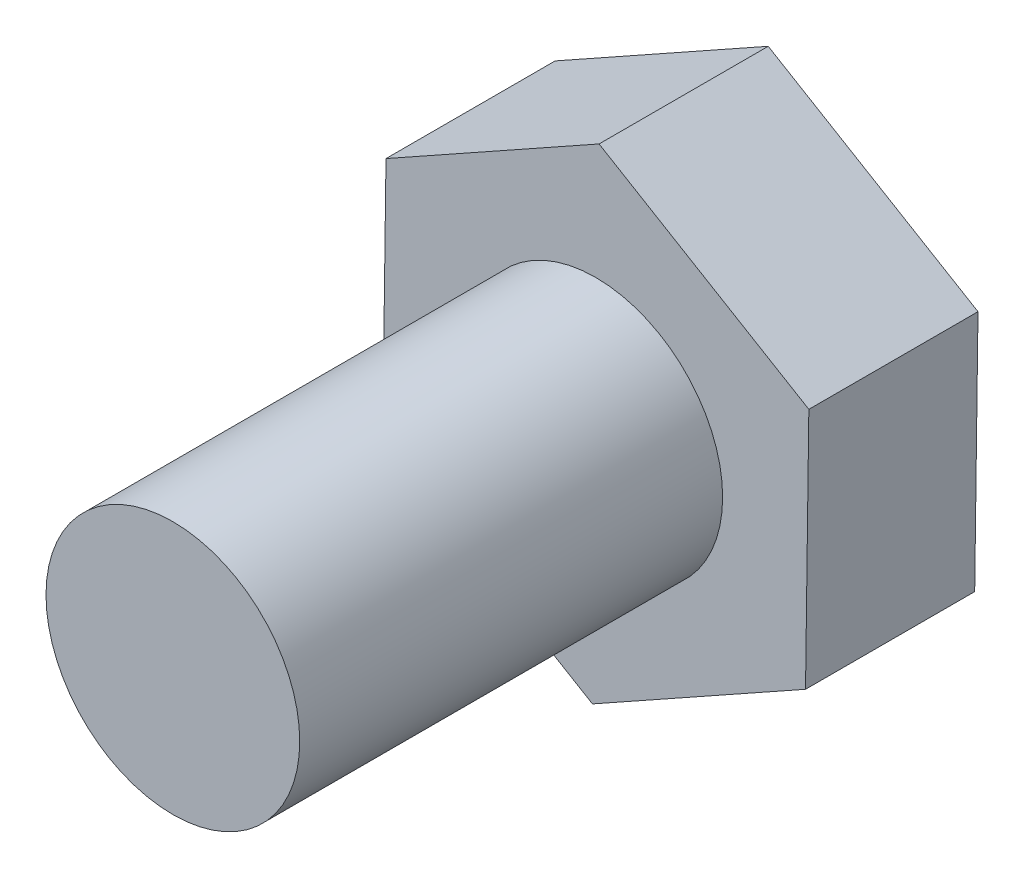
ISO-10303-21;
HEADER;
FILE_DESCRIPTION(('STEP AP214'),'2;1');
FILE_NAME('part.step','',(''),(''),'','','');
FILE_SCHEMA(('AUTOMOTIVE_DESIGN { 1 0 10303 214 1 1 1 1 }'));
ENDSEC;
DATA;
#1=APPLICATION_CONTEXT('core data for automotive mechanical design processes');
#2=APPLICATION_PROTOCOL_DEFINITION('international standard','automotive_design',2000,#1);
#3=PRODUCT_CONTEXT('',#1,'mechanical');
#4=PRODUCT('Part','Part','',(#3));
#5=PRODUCT_RELATED_PRODUCT_CATEGORY('part','',(#4));
#6=PRODUCT_DEFINITION_FORMATION('','',#4);
#7=PRODUCT_DEFINITION_CONTEXT('part definition',#1,'design');
#8=PRODUCT_DEFINITION('design','',#6,#7);
#9=PRODUCT_DEFINITION_SHAPE('','',#8);
#10=(LENGTH_UNIT() NAMED_UNIT(*) SI_UNIT(.MILLI.,.METRE.));
#11=(NAMED_UNIT(*) PLANE_ANGLE_UNIT() SI_UNIT($,.RADIAN.));
#12=(NAMED_UNIT(*) SI_UNIT($,.STERADIAN.) SOLID_ANGLE_UNIT());
#13=UNCERTAINTY_MEASURE_WITH_UNIT(LENGTH_MEASURE(1.E-05),#10,'distance_accuracy_value','');
#14=(GEOMETRIC_REPRESENTATION_CONTEXT(3) GLOBAL_UNCERTAINTY_ASSIGNED_CONTEXT((#13)) GLOBAL_UNIT_ASSIGNED_CONTEXT((#10,
#11,#12)) REPRESENTATION_CONTEXT('',''));
#15=CARTESIAN_POINT('',(0.,0.,0.));
#16=DIRECTION('',(0.,0.,1.));
#17=DIRECTION('',(1.,0.,0.));
#18=AXIS2_PLACEMENT_3D('',#15,#16,#17);
#19=CARTESIAN_POINT('',(-0.0783467129785345,-5.77297108306449,4.));
#20=DIRECTION('',(-0.488201954377901,0.872730686833916,0.));
#21=DIRECTION('',(-0.872730686833916,-0.488201954377901,0.));
#22=AXIS2_PLACEMENT_3D('',#19,#20,#21);
#23=PLANE('',#22);
#24=DIRECTION('',(0.872730686833916,0.488201954377901,0.));
#25=VECTOR('',#24,1.);
#26=CARTESIAN_POINT('',(-0.0783467129785345,-5.77297108306449,0.));
#27=LINE('',#26,#25);
#28=CARTESIAN_POINT('',(-0.0783467129785345,-5.77297108306449,0.));
#29=VERTEX_POINT('',#28);
#30=CARTESIAN_POINT('',(4.96036625675755,-2.95433578527466,0.));
#31=VERTEX_POINT('',#30);
#32=EDGE_CURVE('E117',#29,#31,#27,.T.);
#33=ORIENTED_EDGE('',*,*,#32,.T.);
#34=DIRECTION('',(0.,0.,-1.));
#35=VECTOR('',#34,1.);
#36=CARTESIAN_POINT('',(4.96036625675755,-2.95433578527466,4.));
#37=LINE('',#36,#35);
#38=CARTESIAN_POINT('',(4.96036625675755,-2.95433578527466,4.));
#39=VERTEX_POINT('',#38);
#40=EDGE_CURVE('E11',#39,#31,#37,.T.);
#41=ORIENTED_EDGE('',*,*,#40,.F.);
#42=DIRECTION('',(0.872730686833916,0.488201954377901,0.));
#43=VECTOR('',#42,1.);
#44=CARTESIAN_POINT('',(-0.0783467129785345,-5.77297108306449,4.));
#45=LINE('',#44,#43);
#46=CARTESIAN_POINT('',(-0.0783467129785345,-5.77297108306449,4.));
#47=VERTEX_POINT('',#46);
#48=EDGE_CURVE('E128',#47,#39,#45,.T.);
#49=ORIENTED_EDGE('',*,*,#48,.F.);
#50=DIRECTION('',(0.,0.,-1.));
#51=VECTOR('',#50,1.);
#52=CARTESIAN_POINT('',(-0.0783467129785345,-5.77297108306449,4.));
#53=LINE('',#52,#51);
#54=EDGE_CURVE('E113',#47,#29,#53,.T.);
#55=ORIENTED_EDGE('',*,*,#54,.T.);
#56=EDGE_LOOP('',(#33,#41,#49,#55));
#57=FACE_BOUND('',#56,.T.);
#58=ADVANCED_FACE('F33',(#57),#23,.F.);
#59=CARTESIAN_POINT('',(4.96036625675755,-2.95433578527466,4.));
#60=DIRECTION('',(-0.999907922649363,0.0135700487484835,0.));
#61=DIRECTION('',(-0.0135700487484835,-0.999907922649363,0.));
#62=AXIS2_PLACEMENT_3D('',#59,#60,#61);
#63=PLANE('',#62);
#64=DIRECTION('',(0.0135700487484835,0.999907922649363,0.));
#65=VECTOR('',#64,1.);
#66=CARTESIAN_POINT('',(4.96036625675755,-2.95433578527466,0.));
#67=LINE('',#66,#65);
#68=CARTESIAN_POINT('',(5.03871296973608,2.81863529778983,0.));
#69=VERTEX_POINT('',#68);
#70=EDGE_CURVE('E120',#31,#69,#67,.T.);
#71=ORIENTED_EDGE('',*,*,#70,.T.);
#72=DIRECTION('',(0.,0.,-1.));
#73=VECTOR('',#72,1.);
#74=CARTESIAN_POINT('',(5.03871296973608,2.81863529778983,4.));
#75=LINE('',#74,#73);
#76=CARTESIAN_POINT('',(5.03871296973608,2.81863529778983,4.));
#77=VERTEX_POINT('',#76);
#78=EDGE_CURVE('E41',#77,#69,#75,.T.);
#79=ORIENTED_EDGE('',*,*,#78,.F.);
#80=DIRECTION('',(0.0135700487484835,0.999907922649363,0.));
#81=VECTOR('',#80,1.);
#82=CARTESIAN_POINT('',(4.96036625675755,-2.95433578527466,4.));
#83=LINE('',#82,#81);
#84=EDGE_CURVE('E86',#39,#77,#83,.T.);
#85=ORIENTED_EDGE('',*,*,#84,.F.);
#86=ORIENTED_EDGE('',*,*,#40,.T.);
#87=EDGE_LOOP('',(#71,#79,#85,#86));
#88=FACE_BOUND('',#87,.T.);
#89=ADVANCED_FACE('F153',(#88),#63,.F.);
#90=CARTESIAN_POINT('',(5.03871296973608,2.81863529778983,4.));
#91=DIRECTION('',(-0.511705968271462,-0.859160638085432,0.));
#92=DIRECTION('',(0.859160638085432,-0.511705968271462,0.));
#93=AXIS2_PLACEMENT_3D('',#90,#91,#92);
#94=PLANE('',#93);
#95=DIRECTION('',(-0.859160638085432,0.511705968271462,0.));
#96=VECTOR('',#95,1.);
#97=CARTESIAN_POINT('',(5.03871296973608,2.81863529778983,0.));
#98=LINE('',#97,#96);
#99=CARTESIAN_POINT('',(0.0783467129785357,5.77297108306449,0.));
#100=VERTEX_POINT('',#99);
#101=EDGE_CURVE('E123',#69,#100,#98,.T.);
#102=ORIENTED_EDGE('',*,*,#101,.T.);
#103=DIRECTION('',(0.,0.,-1.));
#104=VECTOR('',#103,1.);
#105=CARTESIAN_POINT('',(0.0783467129785357,5.77297108306449,4.));
#106=LINE('',#105,#104);
#107=CARTESIAN_POINT('',(0.0783467129785357,5.77297108306449,4.));
#108=VERTEX_POINT('',#107);
#109=EDGE_CURVE('E108',#108,#100,#106,.T.);
#110=ORIENTED_EDGE('',*,*,#109,.F.);
#111=DIRECTION('',(-0.859160638085432,0.511705968271462,0.));
#112=VECTOR('',#111,1.);
#113=CARTESIAN_POINT('',(5.03871296973608,2.81863529778983,4.));
#114=LINE('',#113,#112);
#115=EDGE_CURVE('E99',#77,#108,#114,.T.);
#116=ORIENTED_EDGE('',*,*,#115,.F.);
#117=ORIENTED_EDGE('',*,*,#78,.T.);
#118=EDGE_LOOP('',(#102,#110,#116,#117));
#119=FACE_BOUND('',#118,.T.);
#120=ADVANCED_FACE('F134',(#119),#94,.F.);
#121=CARTESIAN_POINT('',(0.0783467129785357,5.77297108306449,4.));
#122=DIRECTION('',(0.488201954377901,-0.872730686833916,0.));
#123=DIRECTION('',(0.872730686833916,0.488201954377901,0.));
#124=AXIS2_PLACEMENT_3D('',#121,#122,#123);
#125=PLANE('',#124);
#126=DIRECTION('',(-0.872730686833916,-0.488201954377901,0.));
#127=VECTOR('',#126,1.);
#128=CARTESIAN_POINT('',(0.0783467129785357,5.77297108306449,0.));
#129=LINE('',#128,#127);
#130=CARTESIAN_POINT('',(-4.96036625675755,2.95433578527466,0.));
#131=VERTEX_POINT('',#130);
#132=EDGE_CURVE('E107',#100,#131,#129,.T.);
#133=ORIENTED_EDGE('',*,*,#132,.T.);
#134=DIRECTION('',(0.,0.,-1.));
#135=VECTOR('',#134,1.);
#136=CARTESIAN_POINT('',(-4.96036625675755,2.95433578527466,4.));
#137=LINE('',#136,#135);
#138=CARTESIAN_POINT('',(-4.96036625675755,2.95433578527466,4.));
#139=VERTEX_POINT('',#138);
#140=EDGE_CURVE('E104',#139,#131,#137,.T.);
#141=ORIENTED_EDGE('',*,*,#140,.F.);
#142=DIRECTION('',(-0.872730686833916,-0.488201954377901,0.));
#143=VECTOR('',#142,1.);
#144=CARTESIAN_POINT('',(0.0783467129785357,5.77297108306449,4.));
#145=LINE('',#144,#143);
#146=EDGE_CURVE('E93',#108,#139,#145,.T.);
#147=ORIENTED_EDGE('',*,*,#146,.F.);
#148=ORIENTED_EDGE('',*,*,#109,.T.);
#149=EDGE_LOOP('',(#133,#141,#147,#148));
#150=FACE_BOUND('',#149,.T.);
#151=ADVANCED_FACE('F105',(#150),#125,.F.);
#152=CARTESIAN_POINT('',(-4.96036625675755,2.95433578527466,4.));
#153=DIRECTION('',(0.999907922649363,-0.0135700487484838,0.));
#154=DIRECTION('',(0.0135700487484838,0.999907922649363,0.));
#155=AXIS2_PLACEMENT_3D('',#152,#153,#154);
#156=PLANE('',#155);
#157=DIRECTION('',(-0.0135700487484838,-0.999907922649363,0.));
#158=VECTOR('',#157,1.);
#159=CARTESIAN_POINT('',(-4.96036625675755,2.95433578527466,0.));
#160=LINE('',#159,#158);
#161=CARTESIAN_POINT('',(-5.03871296973608,-2.81863529778983,0.));
#162=VERTEX_POINT('',#161);
#163=EDGE_CURVE('E72',#131,#162,#160,.T.);
#164=ORIENTED_EDGE('',*,*,#163,.T.);
#165=DIRECTION('',(0.,0.,-1.));
#166=VECTOR('',#165,1.);
#167=CARTESIAN_POINT('',(-5.03871296973608,-2.81863529778983,4.));
#168=LINE('',#167,#166);
#169=CARTESIAN_POINT('',(-5.03871296973608,-2.81863529778983,4.));
#170=VERTEX_POINT('',#169);
#171=EDGE_CURVE('E109',#170,#162,#168,.T.);
#172=ORIENTED_EDGE('',*,*,#171,.F.);
#173=DIRECTION('',(-0.0135700487484838,-0.999907922649363,0.));
#174=VECTOR('',#173,1.);
#175=CARTESIAN_POINT('',(-4.96036625675755,2.95433578527466,4.));
#176=LINE('',#175,#174);
#177=EDGE_CURVE('E97',#139,#170,#176,.T.);
#178=ORIENTED_EDGE('',*,*,#177,.F.);
#179=ORIENTED_EDGE('',*,*,#140,.T.);
#180=EDGE_LOOP('',(#164,#172,#178,#179));
#181=FACE_BOUND('',#180,.T.);
#182=ADVANCED_FACE('F111',(#181),#156,.F.);
#183=CARTESIAN_POINT('',(-5.03871296973608,-2.81863529778983,4.));
#184=DIRECTION('',(0.511705968271462,0.859160638085432,0.));
#185=DIRECTION('',(-0.859160638085432,0.511705968271462,0.));
#186=AXIS2_PLACEMENT_3D('',#183,#184,#185);
#187=PLANE('',#186);
#188=DIRECTION('',(0.859160638085432,-0.511705968271462,0.));
#189=VECTOR('',#188,1.);
#190=CARTESIAN_POINT('',(-5.03871296973608,-2.81863529778983,0.));
#191=LINE('',#190,#189);
#192=EDGE_CURVE('E78',#162,#29,#191,.T.);
#193=ORIENTED_EDGE('',*,*,#192,.T.);
#194=ORIENTED_EDGE('',*,*,#54,.F.);
#195=DIRECTION('',(0.859160638085432,-0.511705968271462,0.));
#196=VECTOR('',#195,1.);
#197=CARTESIAN_POINT('',(-5.03871296973608,-2.81863529778983,4.));
#198=LINE('',#197,#196);
#199=EDGE_CURVE('E49',#170,#47,#198,.T.);
#200=ORIENTED_EDGE('',*,*,#199,.F.);
#201=ORIENTED_EDGE('',*,*,#171,.T.);
#202=EDGE_LOOP('',(#193,#194,#200,#201));
#203=FACE_BOUND('',#202,.T.);
#204=ADVANCED_FACE('F141',(#203),#187,.F.);
#205=CARTESIAN_POINT('',(0.,0.,4.));
#206=DIRECTION('',(0.,0.,1.));
#207=DIRECTION('',(1.,0.,0.));
#208=AXIS2_PLACEMENT_3D('',#205,#206,#207);
#209=PLANE('',#208);
#210=CARTESIAN_POINT('',(0.,0.,4.));
#211=DIRECTION('',(0.,0.,1.));
#212=DIRECTION('',(1.,0.,0.));
#213=AXIS2_PLACEMENT_3D('',#210,#211,#212);
#214=CIRCLE('',#213,3.);
#215=CARTESIAN_POINT('',(3.,0.,4.));
#216=VERTEX_POINT('',#215);
#217=EDGE_CURVE('E214',#216,#216,#214,.T.);
#218=ORIENTED_EDGE('',*,*,#217,.F.);
#219=EDGE_LOOP('',(#218));
#220=FACE_BOUND('',#219,.T.);
#221=ORIENTED_EDGE('',*,*,#48,.T.);
#222=ORIENTED_EDGE('',*,*,#84,.T.);
#223=ORIENTED_EDGE('',*,*,#115,.T.);
#224=ORIENTED_EDGE('',*,*,#146,.T.);
#225=ORIENTED_EDGE('',*,*,#177,.T.);
#226=ORIENTED_EDGE('',*,*,#199,.T.);
#227=EDGE_LOOP('',(#221,#222,#223,#224,#225,#226));
#228=FACE_BOUND('',#227,.T.);
#229=ADVANCED_FACE('F95',(#220,#228),#209,.T.);
#230=CARTESIAN_POINT('',(0.,0.,0.));
#231=DIRECTION('',(0.,0.,1.));
#232=DIRECTION('',(1.,0.,0.));
#233=AXIS2_PLACEMENT_3D('',#230,#231,#232);
#234=PLANE('',#233);
#235=ORIENTED_EDGE('',*,*,#32,.F.);
#236=ORIENTED_EDGE('',*,*,#192,.F.);
#237=ORIENTED_EDGE('',*,*,#163,.F.);
#238=ORIENTED_EDGE('',*,*,#132,.F.);
#239=ORIENTED_EDGE('',*,*,#101,.F.);
#240=ORIENTED_EDGE('',*,*,#70,.F.);
#241=EDGE_LOOP('',(#235,#236,#237,#238,#239,#240));
#242=FACE_BOUND('',#241,.T.);
#243=ADVANCED_FACE('F137',(#242),#234,.F.);
#244=CARTESIAN_POINT('',(0.,0.,14.));
#245=DIRECTION('',(0.,0.,-1.));
#246=DIRECTION('',(-1.,0.,0.));
#247=AXIS2_PLACEMENT_3D('',#244,#245,#246);
#248=CYLINDRICAL_SURFACE('',#247,3.);
#249=CARTESIAN_POINT('',(0.,0.,14.));
#250=DIRECTION('',(0.,0.,1.));
#251=DIRECTION('',(1.,0.,0.));
#252=AXIS2_PLACEMENT_3D('',#249,#250,#251);
#253=CIRCLE('',#252,3.);
#254=CARTESIAN_POINT('',(3.,0.,14.));
#255=VERTEX_POINT('',#254);
#256=EDGE_CURVE('E121',#255,#255,#253,.T.);
#257=ORIENTED_EDGE('',*,*,#256,.F.);
#258=EDGE_LOOP('',(#257));
#259=FACE_BOUND('',#258,.T.);
#260=ORIENTED_EDGE('',*,*,#217,.T.);
#261=EDGE_LOOP('',(#260));
#262=FACE_BOUND('',#261,.T.);
#263=ADVANCED_FACE('F185',(#259,#262),#248,.T.);
#264=CARTESIAN_POINT('',(0.,0.,14.));
#265=DIRECTION('',(0.,0.,1.));
#266=DIRECTION('',(1.,0.,0.));
#267=AXIS2_PLACEMENT_3D('',#264,#265,#266);
#268=PLANE('',#267);
#269=ORIENTED_EDGE('',*,*,#256,.T.);
#270=EDGE_LOOP('',(#269));
#271=FACE_BOUND('',#270,.T.);
#272=ADVANCED_FACE('F198',(#271),#268,.T.);
#273=CLOSED_SHELL('',(#58,#89,#120,#151,#182,#204,#229,#243,#263,#272));
#274=MANIFOLD_SOLID_BREP('B2',#273);
#275=ADVANCED_BREP_SHAPE_REPRESENTATION('',(#18,#274),#14);
#276=SHAPE_DEFINITION_REPRESENTATION(#9,#275);
ENDSEC;
END-ISO-10303-21;
